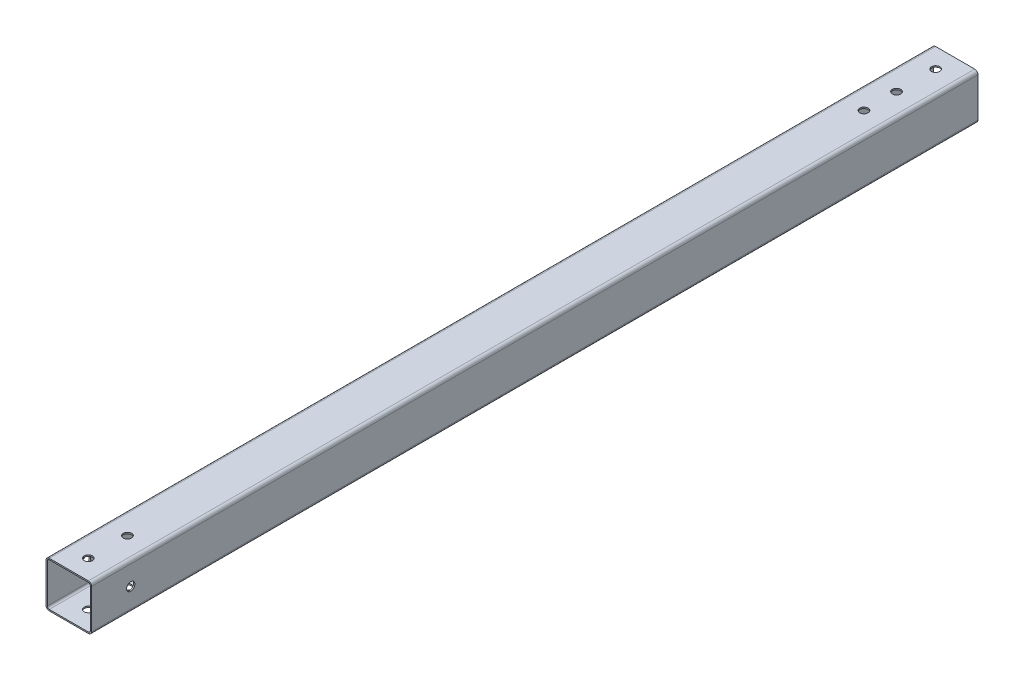
ISO-10303-21;
HEADER;
FILE_DESCRIPTION(('STEP AP214'),'2;1');
FILE_NAME('part.step','',(''),(''),'','','');
FILE_SCHEMA(('AUTOMOTIVE_DESIGN { 1 0 10303 214 1 1 1 1 }'));
ENDSEC;
DATA;
#1=APPLICATION_CONTEXT('core data for automotive mechanical design processes');
#2=APPLICATION_PROTOCOL_DEFINITION('international standard','automotive_design',2000,#1);
#3=PRODUCT_CONTEXT('',#1,'mechanical');
#4=PRODUCT('Part','Part','',(#3));
#5=PRODUCT_RELATED_PRODUCT_CATEGORY('part','',(#4));
#6=PRODUCT_DEFINITION_FORMATION('','',#4);
#7=PRODUCT_DEFINITION_CONTEXT('part definition',#1,'design');
#8=PRODUCT_DEFINITION('design','',#6,#7);
#9=PRODUCT_DEFINITION_SHAPE('','',#8);
#10=(LENGTH_UNIT() NAMED_UNIT(*) SI_UNIT(.MILLI.,.METRE.));
#11=(NAMED_UNIT(*) PLANE_ANGLE_UNIT() SI_UNIT($,.RADIAN.));
#12=(NAMED_UNIT(*) SI_UNIT($,.STERADIAN.) SOLID_ANGLE_UNIT());
#13=UNCERTAINTY_MEASURE_WITH_UNIT(LENGTH_MEASURE(1.E-05),#10,'distance_accuracy_value','');
#14=(GEOMETRIC_REPRESENTATION_CONTEXT(3) GLOBAL_UNCERTAINTY_ASSIGNED_CONTEXT((#13)) GLOBAL_UNIT_ASSIGNED_CONTEXT((#10,
#11,#12)) REPRESENTATION_CONTEXT('',''));
#15=CARTESIAN_POINT('',(0.,0.,0.));
#16=DIRECTION('',(0.,0.,1.));
#17=DIRECTION('',(1.,0.,0.));
#18=AXIS2_PLACEMENT_3D('',#15,#16,#17);
#19=CARTESIAN_POINT('',(30.,-30.0000000000002,680.));
#20=DIRECTION('',(0.,0.,-1.));
#21=DIRECTION('',(0.,1.,0.));
#22=AXIS2_PLACEMENT_3D('',#19,#20,#21);
#23=CYLINDRICAL_SURFACE('',#22,5.);
#24=CARTESIAN_POINT('',(30.,-29.9999999999998,-680.));
#25=DIRECTION('',(0.,0.,1.));
#26=DIRECTION('',(0.,-1.,0.));
#27=AXIS2_PLACEMENT_3D('',#24,#25,#26);
#28=CIRCLE('',#27,5.);
#29=CARTESIAN_POINT('',(30.,-34.9999999999998,-680.));
#30=VERTEX_POINT('',#29);
#31=CARTESIAN_POINT('',(35.,-29.9999999999998,-680.));
#32=VERTEX_POINT('',#31);
#33=EDGE_CURVE('E237',#30,#32,#28,.T.);
#34=ORIENTED_EDGE('',*,*,#33,.T.);
#35=DIRECTION('',(0.,0.,-1.));
#36=VECTOR('',#35,1.);
#37=CARTESIAN_POINT('',(35.,-30.0000000000002,680.));
#38=LINE('',#37,#36);
#39=CARTESIAN_POINT('',(35.,-30.0000000000002,680.));
#40=VERTEX_POINT('',#39);
#41=EDGE_CURVE('E12',#40,#32,#38,.T.);
#42=ORIENTED_EDGE('',*,*,#41,.F.);
#43=CARTESIAN_POINT('',(30.,-30.0000000000002,680.));
#44=DIRECTION('',(0.,0.,1.));
#45=DIRECTION('',(0.,-1.,0.));
#46=AXIS2_PLACEMENT_3D('',#43,#44,#45);
#47=CIRCLE('',#46,5.);
#48=CARTESIAN_POINT('',(30.,-35.0000000000002,680.));
#49=VERTEX_POINT('',#48);
#50=EDGE_CURVE('E316',#49,#40,#47,.T.);
#51=ORIENTED_EDGE('',*,*,#50,.F.);
#52=DIRECTION('',(0.,0.,-1.));
#53=VECTOR('',#52,1.);
#54=CARTESIAN_POINT('',(30.,-35.0000000000002,680.));
#55=LINE('',#54,#53);
#56=EDGE_CURVE('E252',#49,#30,#55,.T.);
#57=ORIENTED_EDGE('',*,*,#56,.T.);
#58=EDGE_LOOP('',(#34,#42,#51,#57));
#59=FACE_BOUND('',#58,.T.);
#60=ADVANCED_FACE('F63',(#59),#23,.T.);
#61=CARTESIAN_POINT('',(35.,-30.0000000000002,680.));
#62=DIRECTION('',(-1.,0.,0.));
#63=DIRECTION('',(0.,0.,1.));
#64=AXIS2_PLACEMENT_3D('',#61,#62,#63);
#65=PLANE('',#64);
#66=CARTESIAN_POINT('',(35.,0.,620.));
#67=DIRECTION('',(-1.,0.,0.));
#68=DIRECTION('',(0.,0.,1.));
#69=AXIS2_PLACEMENT_3D('',#66,#67,#68);
#70=CIRCLE('',#69,6.34999999999994);
#71=CARTESIAN_POINT('',(35.,0.,626.35));
#72=VERTEX_POINT('',#71);
#73=EDGE_CURVE('E397',#72,#72,#70,.T.);
#74=ORIENTED_EDGE('',*,*,#73,.T.);
#75=EDGE_LOOP('',(#74));
#76=FACE_BOUND('',#75,.T.);
#77=DIRECTION('',(0.,1.,0.));
#78=VECTOR('',#77,1.);
#79=CARTESIAN_POINT('',(35.,-29.9999999999998,-680.));
#80=LINE('',#79,#78);
#81=CARTESIAN_POINT('',(35.,30.0000000000002,-680.));
#82=VERTEX_POINT('',#81);
#83=EDGE_CURVE('E240',#32,#82,#80,.T.);
#84=ORIENTED_EDGE('',*,*,#83,.T.);
#85=DIRECTION('',(0.,0.,-1.));
#86=VECTOR('',#85,1.);
#87=CARTESIAN_POINT('',(35.,29.9999999999998,680.));
#88=LINE('',#87,#86);
#89=CARTESIAN_POINT('',(35.,29.9999999999998,680.));
#90=VERTEX_POINT('',#89);
#91=EDGE_CURVE('E73',#90,#82,#88,.T.);
#92=ORIENTED_EDGE('',*,*,#91,.F.);
#93=DIRECTION('',(0.,1.,0.));
#94=VECTOR('',#93,1.);
#95=CARTESIAN_POINT('',(35.,-30.0000000000002,680.));
#96=LINE('',#95,#94);
#97=EDGE_CURVE('E318',#40,#90,#96,.T.);
#98=ORIENTED_EDGE('',*,*,#97,.F.);
#99=ORIENTED_EDGE('',*,*,#41,.T.);
#100=EDGE_LOOP('',(#84,#92,#98,#99));
#101=FACE_BOUND('',#100,.T.);
#102=ADVANCED_FACE('F356',(#76,#101),#65,.F.);
#103=CARTESIAN_POINT('',(30.,29.9999999999998,680.));
#104=DIRECTION('',(0.,0.,-1.));
#105=DIRECTION('',(0.,1.,0.));
#106=AXIS2_PLACEMENT_3D('',#103,#104,#105);
#107=CYLINDRICAL_SURFACE('',#106,5.00000000000001);
#108=CARTESIAN_POINT('',(30.,30.0000000000002,-680.));
#109=DIRECTION('',(0.,0.,1.));
#110=DIRECTION('',(0.,-1.,0.));
#111=AXIS2_PLACEMENT_3D('',#108,#109,#110);
#112=CIRCLE('',#111,5.00000000000001);
#113=CARTESIAN_POINT('',(30.,35.0000000000003,-680.));
#114=VERTEX_POINT('',#113);
#115=EDGE_CURVE('E242',#82,#114,#112,.T.);
#116=ORIENTED_EDGE('',*,*,#115,.T.);
#117=DIRECTION('',(0.,0.,-1.));
#118=VECTOR('',#117,1.);
#119=CARTESIAN_POINT('',(30.,34.9999999999998,680.));
#120=LINE('',#119,#118);
#121=CARTESIAN_POINT('',(30.,34.9999999999998,680.));
#122=VERTEX_POINT('',#121);
#123=EDGE_CURVE('E259',#122,#114,#120,.T.);
#124=ORIENTED_EDGE('',*,*,#123,.F.);
#125=CARTESIAN_POINT('',(30.,29.9999999999998,680.));
#126=DIRECTION('',(0.,0.,1.));
#127=DIRECTION('',(0.,-1.,0.));
#128=AXIS2_PLACEMENT_3D('',#125,#126,#127);
#129=CIRCLE('',#128,5.00000000000001);
#130=EDGE_CURVE('E320',#90,#122,#129,.T.);
#131=ORIENTED_EDGE('',*,*,#130,.F.);
#132=ORIENTED_EDGE('',*,*,#91,.T.);
#133=EDGE_LOOP('',(#116,#124,#131,#132));
#134=FACE_BOUND('',#133,.T.);
#135=ADVANCED_FACE('F361',(#134),#107,.T.);
#136=CARTESIAN_POINT('',(-30.,34.9999999999998,680.));
#137=DIRECTION('',(0.,-1.,0.));
#138=DIRECTION('',(0.,0.,-1.));
#139=AXIS2_PLACEMENT_3D('',#136,#137,#138);
#140=PLANE('',#139);
#141=CARTESIAN_POINT('',(0.,35.0000000000003,-540.));
#142=DIRECTION('',(0.,-1.,0.));
#143=DIRECTION('',(0.,0.,-1.));
#144=AXIS2_PLACEMENT_3D('',#141,#142,#143);
#145=CIRCLE('',#144,6.35);
#146=CARTESIAN_POINT('',(0.,35.0000000000003,-546.35));
#147=VERTEX_POINT('',#146);
#148=EDGE_CURVE('E394',#147,#147,#145,.T.);
#149=ORIENTED_EDGE('',*,*,#148,.T.);
#150=EDGE_LOOP('',(#149));
#151=FACE_BOUND('',#150,.T.);
#152=CARTESIAN_POINT('',(0.,35.0000000000003,-650.));
#153=DIRECTION('',(0.,-1.,0.));
#154=DIRECTION('',(0.,0.,1.));
#155=AXIS2_PLACEMENT_3D('',#152,#153,#154);
#156=CIRCLE('',#155,6.35);
#157=CARTESIAN_POINT('',(0.,35.0000000000003,-643.65));
#158=VERTEX_POINT('',#157);
#159=EDGE_CURVE('E402',#158,#158,#156,.T.);
#160=ORIENTED_EDGE('',*,*,#159,.T.);
#161=EDGE_LOOP('',(#160));
#162=FACE_BOUND('',#161,.T.);
#163=CARTESIAN_POINT('',(0.,35.0000000000003,-590.));
#164=DIRECTION('',(0.,-1.,0.));
#165=DIRECTION('',(0.,0.,1.));
#166=AXIS2_PLACEMENT_3D('',#163,#164,#165);
#167=CIRCLE('',#166,6.35);
#168=CARTESIAN_POINT('',(0.,35.0000000000003,-583.65));
#169=VERTEX_POINT('',#168);
#170=EDGE_CURVE('E418',#169,#169,#167,.T.);
#171=ORIENTED_EDGE('',*,*,#170,.T.);
#172=EDGE_LOOP('',(#171));
#173=FACE_BOUND('',#172,.T.);
#174=CARTESIAN_POINT('',(0.,35.0000000000003,590.));
#175=DIRECTION('',(0.,-1.,0.));
#176=DIRECTION('',(0.,0.,-1.));
#177=AXIS2_PLACEMENT_3D('',#174,#175,#176);
#178=CIRCLE('',#177,6.35);
#179=CARTESIAN_POINT('',(0.,35.0000000000003,583.65));
#180=VERTEX_POINT('',#179);
#181=EDGE_CURVE('E411',#180,#180,#178,.T.);
#182=ORIENTED_EDGE('',*,*,#181,.T.);
#183=EDGE_LOOP('',(#182));
#184=FACE_BOUND('',#183,.T.);
#185=CARTESIAN_POINT('',(0.,35.0000000000003,650.));
#186=DIRECTION('',(0.,-1.,0.));
#187=DIRECTION('',(0.,0.,-1.));
#188=AXIS2_PLACEMENT_3D('',#185,#186,#187);
#189=CIRCLE('',#188,6.35);
#190=CARTESIAN_POINT('',(0.,35.0000000000003,643.65));
#191=VERTEX_POINT('',#190);
#192=EDGE_CURVE('E447',#191,#191,#189,.T.);
#193=ORIENTED_EDGE('',*,*,#192,.T.);
#194=EDGE_LOOP('',(#193));
#195=FACE_BOUND('',#194,.T.);
#196=DIRECTION('',(-1.,0.,0.));
#197=VECTOR('',#196,1.);
#198=CARTESIAN_POINT('',(-30.,35.0000000000003,-680.));
#199=LINE('',#198,#197);
#200=CARTESIAN_POINT('',(-30.,35.0000000000003,-680.));
#201=VERTEX_POINT('',#200);
#202=EDGE_CURVE('E244',#114,#201,#199,.T.);
#203=ORIENTED_EDGE('',*,*,#202,.T.);
#204=DIRECTION('',(0.,0.,-1.));
#205=VECTOR('',#204,1.);
#206=CARTESIAN_POINT('',(-30.,34.9999999999998,680.));
#207=LINE('',#206,#205);
#208=CARTESIAN_POINT('',(-30.,34.9999999999998,680.));
#209=VERTEX_POINT('',#208);
#210=EDGE_CURVE('E256',#209,#201,#207,.T.);
#211=ORIENTED_EDGE('',*,*,#210,.F.);
#212=DIRECTION('',(-1.,0.,0.));
#213=VECTOR('',#212,1.);
#214=CARTESIAN_POINT('',(-30.,34.9999999999998,680.));
#215=LINE('',#214,#213);
#216=EDGE_CURVE('E322',#122,#209,#215,.T.);
#217=ORIENTED_EDGE('',*,*,#216,.F.);
#218=ORIENTED_EDGE('',*,*,#123,.T.);
#219=EDGE_LOOP('',(#203,#211,#217,#218));
#220=FACE_BOUND('',#219,.T.);
#221=ADVANCED_FACE('F328',(#151,#162,#173,#184,#195,#220),#140,.F.);
#222=CARTESIAN_POINT('',(-30.,29.9999999999998,680.));
#223=DIRECTION('',(0.,0.,-1.));
#224=DIRECTION('',(0.,1.,0.));
#225=AXIS2_PLACEMENT_3D('',#222,#223,#224);
#226=CYLINDRICAL_SURFACE('',#225,5.00000000000001);
#227=CARTESIAN_POINT('',(-30.,30.0000000000002,-680.));
#228=DIRECTION('',(0.,0.,1.));
#229=DIRECTION('',(0.,-1.,0.));
#230=AXIS2_PLACEMENT_3D('',#227,#228,#229);
#231=CIRCLE('',#230,5.00000000000001);
#232=CARTESIAN_POINT('',(-35.,30.0000000000002,-680.));
#233=VERTEX_POINT('',#232);
#234=EDGE_CURVE('E246',#201,#233,#231,.T.);
#235=ORIENTED_EDGE('',*,*,#234,.T.);
#236=DIRECTION('',(0.,0.,-1.));
#237=VECTOR('',#236,1.);
#238=CARTESIAN_POINT('',(-35.,29.9999999999998,680.));
#239=LINE('',#238,#237);
#240=CARTESIAN_POINT('',(-35.,29.9999999999998,680.));
#241=VERTEX_POINT('',#240);
#242=EDGE_CURVE('E203',#241,#233,#239,.T.);
#243=ORIENTED_EDGE('',*,*,#242,.F.);
#244=CARTESIAN_POINT('',(-30.,29.9999999999998,680.));
#245=DIRECTION('',(0.,0.,1.));
#246=DIRECTION('',(0.,-1.,0.));
#247=AXIS2_PLACEMENT_3D('',#244,#245,#246);
#248=CIRCLE('',#247,5.00000000000001);
#249=EDGE_CURVE('E194',#209,#241,#248,.T.);
#250=ORIENTED_EDGE('',*,*,#249,.F.);
#251=ORIENTED_EDGE('',*,*,#210,.T.);
#252=EDGE_LOOP('',(#235,#243,#250,#251));
#253=FACE_BOUND('',#252,.T.);
#254=ADVANCED_FACE('F332',(#253),#226,.T.);
#255=CARTESIAN_POINT('',(-35.,29.9999999999998,680.));
#256=DIRECTION('',(1.,0.,0.));
#257=DIRECTION('',(0.,0.,-1.));
#258=AXIS2_PLACEMENT_3D('',#255,#256,#257);
#259=PLANE('',#258);
#260=CARTESIAN_POINT('',(-35.,0.,620.));
#261=DIRECTION('',(-1.,0.,0.));
#262=DIRECTION('',(0.,0.,1.));
#263=AXIS2_PLACEMENT_3D('',#260,#261,#262);
#264=CIRCLE('',#263,6.34999999999994);
#265=CARTESIAN_POINT('',(-35.,0.,626.35));
#266=VERTEX_POINT('',#265);
#267=EDGE_CURVE('E400',#266,#266,#264,.T.);
#268=ORIENTED_EDGE('',*,*,#267,.F.);
#269=EDGE_LOOP('',(#268));
#270=FACE_BOUND('',#269,.T.);
#271=DIRECTION('',(0.,-1.,0.));
#272=VECTOR('',#271,1.);
#273=CARTESIAN_POINT('',(-35.,30.0000000000002,-680.));
#274=LINE('',#273,#272);
#275=CARTESIAN_POINT('',(-35.,-29.9999999999998,-680.));
#276=VERTEX_POINT('',#275);
#277=EDGE_CURVE('E202',#233,#276,#274,.T.);
#278=ORIENTED_EDGE('',*,*,#277,.T.);
#279=DIRECTION('',(0.,0.,-1.));
#280=VECTOR('',#279,1.);
#281=CARTESIAN_POINT('',(-35.,-30.0000000000002,680.));
#282=LINE('',#281,#280);
#283=CARTESIAN_POINT('',(-35.,-30.0000000000002,680.));
#284=VERTEX_POINT('',#283);
#285=EDGE_CURVE('E199',#284,#276,#282,.T.);
#286=ORIENTED_EDGE('',*,*,#285,.F.);
#287=DIRECTION('',(0.,-1.,0.));
#288=VECTOR('',#287,1.);
#289=CARTESIAN_POINT('',(-35.,29.9999999999998,680.));
#290=LINE('',#289,#288);
#291=EDGE_CURVE('E188',#241,#284,#290,.T.);
#292=ORIENTED_EDGE('',*,*,#291,.F.);
#293=ORIENTED_EDGE('',*,*,#242,.T.);
#294=EDGE_LOOP('',(#278,#286,#292,#293));
#295=FACE_BOUND('',#294,.T.);
#296=ADVANCED_FACE('F200',(#270,#295),#259,.F.);
#297=CARTESIAN_POINT('',(-30.,-30.0000000000002,680.));
#298=DIRECTION('',(0.,0.,-1.));
#299=DIRECTION('',(0.,1.,0.));
#300=AXIS2_PLACEMENT_3D('',#297,#298,#299);
#301=CYLINDRICAL_SURFACE('',#300,5.);
#302=CARTESIAN_POINT('',(-30.,-29.9999999999998,-680.));
#303=DIRECTION('',(0.,0.,1.));
#304=DIRECTION('',(0.,-1.,0.));
#305=AXIS2_PLACEMENT_3D('',#302,#303,#304);
#306=CIRCLE('',#305,5.);
#307=CARTESIAN_POINT('',(-30.,-34.9999999999998,-680.));
#308=VERTEX_POINT('',#307);
#309=EDGE_CURVE('E135',#276,#308,#306,.T.);
#310=ORIENTED_EDGE('',*,*,#309,.T.);
#311=DIRECTION('',(0.,0.,-1.));
#312=VECTOR('',#311,1.);
#313=CARTESIAN_POINT('',(-30.,-35.0000000000002,680.));
#314=LINE('',#313,#312);
#315=CARTESIAN_POINT('',(-30.,-35.0000000000002,680.));
#316=VERTEX_POINT('',#315);
#317=EDGE_CURVE('E204',#316,#308,#314,.T.);
#318=ORIENTED_EDGE('',*,*,#317,.F.);
#319=CARTESIAN_POINT('',(-30.,-30.0000000000002,680.));
#320=DIRECTION('',(0.,0.,1.));
#321=DIRECTION('',(0.,-1.,0.));
#322=AXIS2_PLACEMENT_3D('',#319,#320,#321);
#323=CIRCLE('',#322,5.);
#324=EDGE_CURVE('E192',#284,#316,#323,.T.);
#325=ORIENTED_EDGE('',*,*,#324,.F.);
#326=ORIENTED_EDGE('',*,*,#285,.T.);
#327=EDGE_LOOP('',(#310,#318,#325,#326));
#328=FACE_BOUND('',#327,.T.);
#329=ADVANCED_FACE('F206',(#328),#301,.T.);
#330=CARTESIAN_POINT('',(30.,29.9999999999998,680.));
#331=DIRECTION('',(0.,0.,-1.));
#332=DIRECTION('',(0.,1.,0.));
#333=AXIS2_PLACEMENT_3D('',#330,#331,#332);
#334=CYLINDRICAL_SURFACE('',#333,3.);
#335=CARTESIAN_POINT('',(30.,30.0000000000002,-680.));
#336=DIRECTION('',(0.,0.,1.));
#337=DIRECTION('',(0.,-1.,0.));
#338=AXIS2_PLACEMENT_3D('',#335,#336,#337);
#339=CIRCLE('',#338,3.);
#340=CARTESIAN_POINT('',(33.,30.0000000000002,-680.));
#341=VERTEX_POINT('',#340);
#342=CARTESIAN_POINT('',(30.,33.0000000000002,-680.));
#343=VERTEX_POINT('',#342);
#344=EDGE_CURVE('E212',#341,#343,#339,.T.);
#345=ORIENTED_EDGE('',*,*,#344,.F.);
#346=DIRECTION('',(0.,0.,-1.));
#347=VECTOR('',#346,1.);
#348=CARTESIAN_POINT('',(33.,29.9999999999998,680.));
#349=LINE('',#348,#347);
#350=CARTESIAN_POINT('',(33.,29.9999999999998,680.));
#351=VERTEX_POINT('',#350);
#352=EDGE_CURVE('E149',#351,#341,#349,.T.);
#353=ORIENTED_EDGE('',*,*,#352,.F.);
#354=CARTESIAN_POINT('',(30.,29.9999999999998,680.));
#355=DIRECTION('',(0.,0.,1.));
#356=DIRECTION('',(0.,-1.,0.));
#357=AXIS2_PLACEMENT_3D('',#354,#355,#356);
#358=CIRCLE('',#357,3.);
#359=CARTESIAN_POINT('',(30.,32.9999999999998,680.));
#360=VERTEX_POINT('',#359);
#361=EDGE_CURVE('E251',#351,#360,#358,.T.);
#362=ORIENTED_EDGE('',*,*,#361,.T.);
#363=DIRECTION('',(0.,0.,-1.));
#364=VECTOR('',#363,1.);
#365=CARTESIAN_POINT('',(30.,32.9999999999998,680.));
#366=LINE('',#365,#364);
#367=EDGE_CURVE('E208',#360,#343,#366,.T.);
#368=ORIENTED_EDGE('',*,*,#367,.T.);
#369=EDGE_LOOP('',(#345,#353,#362,#368));
#370=FACE_BOUND('',#369,.T.);
#371=ADVANCED_FACE('F65',(#370),#334,.F.);
#372=CARTESIAN_POINT('',(33.,-30.0000000000002,680.));
#373=DIRECTION('',(-1.,0.,0.));
#374=DIRECTION('',(0.,0.,1.));
#375=AXIS2_PLACEMENT_3D('',#372,#373,#374);
#376=PLANE('',#375);
#377=CARTESIAN_POINT('',(33.,0.,620.));
#378=DIRECTION('',(-1.,0.,0.));
#379=DIRECTION('',(0.,0.,1.));
#380=AXIS2_PLACEMENT_3D('',#377,#378,#379);
#381=CIRCLE('',#380,6.34999999999994);
#382=CARTESIAN_POINT('',(33.,0.,626.35));
#383=VERTEX_POINT('',#382);
#384=EDGE_CURVE('E389',#383,#383,#381,.T.);
#385=ORIENTED_EDGE('',*,*,#384,.F.);
#386=EDGE_LOOP('',(#385));
#387=FACE_BOUND('',#386,.T.);
#388=DIRECTION('',(0.,1.,0.));
#389=VECTOR('',#388,1.);
#390=CARTESIAN_POINT('',(33.,-29.9999999999998,-680.));
#391=LINE('',#390,#389);
#392=CARTESIAN_POINT('',(33.,-29.9999999999998,-680.));
#393=VERTEX_POINT('',#392);
#394=EDGE_CURVE('E215',#393,#341,#391,.T.);
#395=ORIENTED_EDGE('',*,*,#394,.F.);
#396=DIRECTION('',(0.,0.,-1.));
#397=VECTOR('',#396,1.);
#398=CARTESIAN_POINT('',(33.,-30.0000000000002,680.));
#399=LINE('',#398,#397);
#400=CARTESIAN_POINT('',(33.,-30.0000000000002,680.));
#401=VERTEX_POINT('',#400);
#402=EDGE_CURVE('E275',#401,#393,#399,.T.);
#403=ORIENTED_EDGE('',*,*,#402,.F.);
#404=DIRECTION('',(0.,1.,0.));
#405=VECTOR('',#404,1.);
#406=CARTESIAN_POINT('',(33.,-30.0000000000002,680.));
#407=LINE('',#406,#405);
#408=EDGE_CURVE('E281',#401,#351,#407,.T.);
#409=ORIENTED_EDGE('',*,*,#408,.T.);
#410=ORIENTED_EDGE('',*,*,#352,.T.);
#411=EDGE_LOOP('',(#395,#403,#409,#410));
#412=FACE_BOUND('',#411,.T.);
#413=ADVANCED_FACE('F279',(#387,#412),#376,.T.);
#414=CARTESIAN_POINT('',(30.,-30.0000000000002,680.));
#415=DIRECTION('',(0.,0.,-1.));
#416=DIRECTION('',(0.,1.,0.));
#417=AXIS2_PLACEMENT_3D('',#414,#415,#416);
#418=CYLINDRICAL_SURFACE('',#417,2.99999999999999);
#419=CARTESIAN_POINT('',(30.,-29.9999999999998,-680.));
#420=DIRECTION('',(0.,0.,1.));
#421=DIRECTION('',(0.,-1.,0.));
#422=AXIS2_PLACEMENT_3D('',#419,#420,#421);
#423=CIRCLE('',#422,2.99999999999999);
#424=CARTESIAN_POINT('',(30.,-32.9999999999998,-680.));
#425=VERTEX_POINT('',#424);
#426=EDGE_CURVE('E219',#425,#393,#423,.T.);
#427=ORIENTED_EDGE('',*,*,#426,.F.);
#428=DIRECTION('',(0.,0.,-1.));
#429=VECTOR('',#428,1.);
#430=CARTESIAN_POINT('',(30.,-33.0000000000002,680.));
#431=LINE('',#430,#429);
#432=CARTESIAN_POINT('',(30.,-33.0000000000002,680.));
#433=VERTEX_POINT('',#432);
#434=EDGE_CURVE('E273',#433,#425,#431,.T.);
#435=ORIENTED_EDGE('',*,*,#434,.F.);
#436=CARTESIAN_POINT('',(30.,-30.0000000000002,680.));
#437=DIRECTION('',(0.,0.,1.));
#438=DIRECTION('',(0.,-1.,0.));
#439=AXIS2_PLACEMENT_3D('',#436,#437,#438);
#440=CIRCLE('',#439,2.99999999999999);
#441=EDGE_CURVE('E292',#433,#401,#440,.T.);
#442=ORIENTED_EDGE('',*,*,#441,.T.);
#443=ORIENTED_EDGE('',*,*,#402,.T.);
#444=EDGE_LOOP('',(#427,#435,#442,#443));
#445=FACE_BOUND('',#444,.T.);
#446=ADVANCED_FACE('F289',(#445),#418,.F.);
#447=CARTESIAN_POINT('',(30.,-33.0000000000002,680.));
#448=DIRECTION('',(0.,1.,0.));
#449=DIRECTION('',(0.,0.,1.));
#450=AXIS2_PLACEMENT_3D('',#447,#448,#449);
#451=PLANE('',#450);
#452=CARTESIAN_POINT('',(0.,-32.9999999999998,-540.));
#453=DIRECTION('',(0.,1.,0.));
#454=DIRECTION('',(0.,0.,1.));
#455=AXIS2_PLACEMENT_3D('',#452,#453,#454);
#456=CIRCLE('',#455,6.35);
#457=CARTESIAN_POINT('',(0.,-32.9999999999998,-533.65));
#458=VERTEX_POINT('',#457);
#459=EDGE_CURVE('E443',#458,#458,#456,.T.);
#460=ORIENTED_EDGE('',*,*,#459,.F.);
#461=EDGE_LOOP('',(#460));
#462=FACE_BOUND('',#461,.T.);
#463=CARTESIAN_POINT('',(0.,-32.9999999999998,-650.));
#464=DIRECTION('',(0.,1.,0.));
#465=DIRECTION('',(0.,0.,1.));
#466=AXIS2_PLACEMENT_3D('',#463,#464,#465);
#467=CIRCLE('',#466,6.35);
#468=CARTESIAN_POINT('',(0.,-32.9999999999998,-643.65));
#469=VERTEX_POINT('',#468);
#470=EDGE_CURVE('E437',#469,#469,#467,.T.);
#471=ORIENTED_EDGE('',*,*,#470,.F.);
#472=EDGE_LOOP('',(#471));
#473=FACE_BOUND('',#472,.T.);
#474=CARTESIAN_POINT('',(0.,-32.9999999999998,-590.));
#475=DIRECTION('',(0.,1.,0.));
#476=DIRECTION('',(0.,0.,1.));
#477=AXIS2_PLACEMENT_3D('',#474,#475,#476);
#478=CIRCLE('',#477,6.35);
#479=CARTESIAN_POINT('',(0.,-32.9999999999998,-583.65));
#480=VERTEX_POINT('',#479);
#481=EDGE_CURVE('E431',#480,#480,#478,.T.);
#482=ORIENTED_EDGE('',*,*,#481,.F.);
#483=EDGE_LOOP('',(#482));
#484=FACE_BOUND('',#483,.T.);
#485=CARTESIAN_POINT('',(0.,-33.0000000000001,590.));
#486=DIRECTION('',(0.,1.,0.));
#487=DIRECTION('',(0.,0.,1.));
#488=AXIS2_PLACEMENT_3D('',#485,#486,#487);
#489=CIRCLE('',#488,6.35);
#490=CARTESIAN_POINT('',(0.,-33.0000000000001,596.35));
#491=VERTEX_POINT('',#490);
#492=EDGE_CURVE('E425',#491,#491,#489,.T.);
#493=ORIENTED_EDGE('',*,*,#492,.F.);
#494=EDGE_LOOP('',(#493));
#495=FACE_BOUND('',#494,.T.);
#496=CARTESIAN_POINT('',(0.,-33.0000000000002,650.));
#497=DIRECTION('',(0.,1.,0.));
#498=DIRECTION('',(0.,0.,1.));
#499=AXIS2_PLACEMENT_3D('',#496,#497,#498);
#500=CIRCLE('',#499,6.35);
#501=CARTESIAN_POINT('',(0.,-33.0000000000002,656.35));
#502=VERTEX_POINT('',#501);
#503=EDGE_CURVE('E216',#502,#502,#500,.T.);
#504=ORIENTED_EDGE('',*,*,#503,.F.);
#505=EDGE_LOOP('',(#504));
#506=FACE_BOUND('',#505,.T.);
#507=DIRECTION('',(1.,0.,0.));
#508=VECTOR('',#507,1.);
#509=CARTESIAN_POINT('',(30.,-32.9999999999998,-680.));
#510=LINE('',#509,#508);
#511=CARTESIAN_POINT('',(-30.,-32.9999999999998,-680.));
#512=VERTEX_POINT('',#511);
#513=EDGE_CURVE('E222',#512,#425,#510,.T.);
#514=ORIENTED_EDGE('',*,*,#513,.F.);
#515=DIRECTION('',(0.,0.,-1.));
#516=VECTOR('',#515,1.);
#517=CARTESIAN_POINT('',(-30.,-33.0000000000002,680.));
#518=LINE('',#517,#516);
#519=CARTESIAN_POINT('',(-30.,-33.0000000000002,680.));
#520=VERTEX_POINT('',#519);
#521=EDGE_CURVE('E271',#520,#512,#518,.T.);
#522=ORIENTED_EDGE('',*,*,#521,.F.);
#523=DIRECTION('',(1.,0.,0.));
#524=VECTOR('',#523,1.);
#525=CARTESIAN_POINT('',(30.,-33.0000000000002,680.));
#526=LINE('',#525,#524);
#527=EDGE_CURVE('E298',#520,#433,#526,.T.);
#528=ORIENTED_EDGE('',*,*,#527,.T.);
#529=ORIENTED_EDGE('',*,*,#434,.T.);
#530=EDGE_LOOP('',(#514,#522,#528,#529));
#531=FACE_BOUND('',#530,.T.);
#532=ADVANCED_FACE('F376',(#462,#473,#484,#495,#506,#531),#451,.T.);
#533=CARTESIAN_POINT('',(-30.,-30.0000000000002,680.));
#534=DIRECTION('',(0.,0.,-1.));
#535=DIRECTION('',(0.,1.,0.));
#536=AXIS2_PLACEMENT_3D('',#533,#534,#535);
#537=CYLINDRICAL_SURFACE('',#536,2.99999999999999);
#538=CARTESIAN_POINT('',(-30.,-29.9999999999998,-680.));
#539=DIRECTION('',(0.,0.,1.));
#540=DIRECTION('',(0.,-1.,0.));
#541=AXIS2_PLACEMENT_3D('',#538,#539,#540);
#542=CIRCLE('',#541,2.99999999999999);
#543=CARTESIAN_POINT('',(-33.,-29.9999999999998,-680.));
#544=VERTEX_POINT('',#543);
#545=EDGE_CURVE('E225',#544,#512,#542,.T.);
#546=ORIENTED_EDGE('',*,*,#545,.F.);
#547=DIRECTION('',(0.,0.,-1.));
#548=VECTOR('',#547,1.);
#549=CARTESIAN_POINT('',(-33.,-30.0000000000002,680.));
#550=LINE('',#549,#548);
#551=CARTESIAN_POINT('',(-33.,-30.0000000000002,680.));
#552=VERTEX_POINT('',#551);
#553=EDGE_CURVE('E269',#552,#544,#550,.T.);
#554=ORIENTED_EDGE('',*,*,#553,.F.);
#555=CARTESIAN_POINT('',(-30.,-30.0000000000002,680.));
#556=DIRECTION('',(0.,0.,1.));
#557=DIRECTION('',(0.,-1.,0.));
#558=AXIS2_PLACEMENT_3D('',#555,#556,#557);
#559=CIRCLE('',#558,2.99999999999999);
#560=EDGE_CURVE('E304',#552,#520,#559,.T.);
#561=ORIENTED_EDGE('',*,*,#560,.T.);
#562=ORIENTED_EDGE('',*,*,#521,.T.);
#563=EDGE_LOOP('',(#546,#554,#561,#562));
#564=FACE_BOUND('',#563,.T.);
#565=ADVANCED_FACE('F372',(#564),#537,.F.);
#566=CARTESIAN_POINT('',(-33.,29.9999999999998,680.));
#567=DIRECTION('',(1.,0.,0.));
#568=DIRECTION('',(0.,0.,-1.));
#569=AXIS2_PLACEMENT_3D('',#566,#567,#568);
#570=PLANE('',#569);
#571=CARTESIAN_POINT('',(-33.,0.,620.));
#572=DIRECTION('',(1.,0.,0.));
#573=DIRECTION('',(0.,0.,-1.));
#574=AXIS2_PLACEMENT_3D('',#571,#572,#573);
#575=CIRCLE('',#574,6.34999999999994);
#576=CARTESIAN_POINT('',(-33.,0.,613.65));
#577=VERTEX_POINT('',#576);
#578=EDGE_CURVE('E67',#577,#577,#575,.T.);
#579=ORIENTED_EDGE('',*,*,#578,.F.);
#580=EDGE_LOOP('',(#579));
#581=FACE_BOUND('',#580,.T.);
#582=DIRECTION('',(0.,-1.,0.));
#583=VECTOR('',#582,1.);
#584=CARTESIAN_POINT('',(-33.,30.0000000000002,-680.));
#585=LINE('',#584,#583);
#586=CARTESIAN_POINT('',(-33.,30.0000000000002,-680.));
#587=VERTEX_POINT('',#586);
#588=EDGE_CURVE('E228',#587,#544,#585,.T.);
#589=ORIENTED_EDGE('',*,*,#588,.F.);
#590=DIRECTION('',(0.,0.,-1.));
#591=VECTOR('',#590,1.);
#592=CARTESIAN_POINT('',(-33.,29.9999999999998,680.));
#593=LINE('',#592,#591);
#594=CARTESIAN_POINT('',(-33.,29.9999999999998,680.));
#595=VERTEX_POINT('',#594);
#596=EDGE_CURVE('E267',#595,#587,#593,.T.);
#597=ORIENTED_EDGE('',*,*,#596,.F.);
#598=DIRECTION('',(0.,-1.,0.));
#599=VECTOR('',#598,1.);
#600=CARTESIAN_POINT('',(-33.,29.9999999999998,680.));
#601=LINE('',#600,#599);
#602=EDGE_CURVE('E307',#595,#552,#601,.T.);
#603=ORIENTED_EDGE('',*,*,#602,.T.);
#604=ORIENTED_EDGE('',*,*,#553,.T.);
#605=EDGE_LOOP('',(#589,#597,#603,#604));
#606=FACE_BOUND('',#605,.T.);
#607=ADVANCED_FACE('F368',(#581,#606),#570,.T.);
#608=CARTESIAN_POINT('',(-30.,29.9999999999998,680.));
#609=DIRECTION('',(0.,0.,-1.));
#610=DIRECTION('',(0.,1.,0.));
#611=AXIS2_PLACEMENT_3D('',#608,#609,#610);
#612=CYLINDRICAL_SURFACE('',#611,3.);
#613=CARTESIAN_POINT('',(-30.,30.0000000000002,-680.));
#614=DIRECTION('',(0.,0.,1.));
#615=DIRECTION('',(0.,-1.,0.));
#616=AXIS2_PLACEMENT_3D('',#613,#614,#615);
#617=CIRCLE('',#616,3.);
#618=CARTESIAN_POINT('',(-30.,33.0000000000002,-680.));
#619=VERTEX_POINT('',#618);
#620=EDGE_CURVE('E231',#619,#587,#617,.T.);
#621=ORIENTED_EDGE('',*,*,#620,.F.);
#622=DIRECTION('',(0.,0.,-1.));
#623=VECTOR('',#622,1.);
#624=CARTESIAN_POINT('',(-30.,32.9999999999998,680.));
#625=LINE('',#624,#623);
#626=CARTESIAN_POINT('',(-30.,32.9999999999998,680.));
#627=VERTEX_POINT('',#626);
#628=EDGE_CURVE('E265',#627,#619,#625,.T.);
#629=ORIENTED_EDGE('',*,*,#628,.F.);
#630=CARTESIAN_POINT('',(-30.,29.9999999999998,680.));
#631=DIRECTION('',(0.,0.,1.));
#632=DIRECTION('',(0.,-1.,0.));
#633=AXIS2_PLACEMENT_3D('',#630,#631,#632);
#634=CIRCLE('',#633,3.);
#635=EDGE_CURVE('E310',#627,#595,#634,.T.);
#636=ORIENTED_EDGE('',*,*,#635,.T.);
#637=ORIENTED_EDGE('',*,*,#596,.T.);
#638=EDGE_LOOP('',(#621,#629,#636,#637));
#639=FACE_BOUND('',#638,.T.);
#640=ADVANCED_FACE('F348',(#639),#612,.F.);
#641=CARTESIAN_POINT('',(-30.,32.9999999999998,680.));
#642=DIRECTION('',(0.,-1.,0.));
#643=DIRECTION('',(0.,0.,-1.));
#644=AXIS2_PLACEMENT_3D('',#641,#642,#643);
#645=PLANE('',#644);
#646=CARTESIAN_POINT('',(0.,33.0000000000002,-540.));
#647=DIRECTION('',(0.,-1.,0.));
#648=DIRECTION('',(0.,0.,-1.));
#649=AXIS2_PLACEMENT_3D('',#646,#647,#648);
#650=CIRCLE('',#649,6.35);
#651=CARTESIAN_POINT('',(0.,33.0000000000002,-546.35));
#652=VERTEX_POINT('',#651);
#653=EDGE_CURVE('E440',#652,#652,#650,.T.);
#654=ORIENTED_EDGE('',*,*,#653,.F.);
#655=EDGE_LOOP('',(#654));
#656=FACE_BOUND('',#655,.T.);
#657=CARTESIAN_POINT('',(0.,33.0000000000002,-650.));
#658=DIRECTION('',(0.,-1.,0.));
#659=DIRECTION('',(0.,0.,-1.));
#660=AXIS2_PLACEMENT_3D('',#657,#658,#659);
#661=CIRCLE('',#660,6.35);
#662=CARTESIAN_POINT('',(0.,33.0000000000002,-656.35));
#663=VERTEX_POINT('',#662);
#664=EDGE_CURVE('E434',#663,#663,#661,.T.);
#665=ORIENTED_EDGE('',*,*,#664,.F.);
#666=EDGE_LOOP('',(#665));
#667=FACE_BOUND('',#666,.T.);
#668=CARTESIAN_POINT('',(0.,33.0000000000002,-590.));
#669=DIRECTION('',(0.,-1.,0.));
#670=DIRECTION('',(0.,0.,-1.));
#671=AXIS2_PLACEMENT_3D('',#668,#669,#670);
#672=CIRCLE('',#671,6.35);
#673=CARTESIAN_POINT('',(0.,33.0000000000002,-596.35));
#674=VERTEX_POINT('',#673);
#675=EDGE_CURVE('E428',#674,#674,#672,.T.);
#676=ORIENTED_EDGE('',*,*,#675,.F.);
#677=EDGE_LOOP('',(#676));
#678=FACE_BOUND('',#677,.T.);
#679=CARTESIAN_POINT('',(0.,32.9999999999999,590.));
#680=DIRECTION('',(0.,-1.,0.));
#681=DIRECTION('',(0.,0.,-1.));
#682=AXIS2_PLACEMENT_3D('',#679,#680,#681);
#683=CIRCLE('',#682,6.35);
#684=CARTESIAN_POINT('',(0.,32.9999999999999,583.65));
#685=VERTEX_POINT('',#684);
#686=EDGE_CURVE('E414',#685,#685,#683,.T.);
#687=ORIENTED_EDGE('',*,*,#686,.F.);
#688=EDGE_LOOP('',(#687));
#689=FACE_BOUND('',#688,.T.);
#690=CARTESIAN_POINT('',(0.,32.9999999999998,650.));
#691=DIRECTION('',(0.,-1.,0.));
#692=DIRECTION('',(0.,0.,-1.));
#693=AXIS2_PLACEMENT_3D('',#690,#691,#692);
#694=CIRCLE('',#693,6.35);
#695=CARTESIAN_POINT('',(0.,32.9999999999998,643.65));
#696=VERTEX_POINT('',#695);
#697=EDGE_CURVE('E450',#696,#696,#694,.T.);
#698=ORIENTED_EDGE('',*,*,#697,.F.);
#699=EDGE_LOOP('',(#698));
#700=FACE_BOUND('',#699,.T.);
#701=DIRECTION('',(-1.,0.,0.));
#702=VECTOR('',#701,1.);
#703=CARTESIAN_POINT('',(-30.,33.0000000000002,-680.));
#704=LINE('',#703,#702);
#705=EDGE_CURVE('E234',#343,#619,#704,.T.);
#706=ORIENTED_EDGE('',*,*,#705,.F.);
#707=ORIENTED_EDGE('',*,*,#367,.F.);
#708=DIRECTION('',(-1.,0.,0.));
#709=VECTOR('',#708,1.);
#710=CARTESIAN_POINT('',(-30.,32.9999999999998,680.));
#711=LINE('',#710,#709);
#712=EDGE_CURVE('E313',#360,#627,#711,.T.);
#713=ORIENTED_EDGE('',*,*,#712,.T.);
#714=ORIENTED_EDGE('',*,*,#628,.T.);
#715=EDGE_LOOP('',(#706,#707,#713,#714));
#716=FACE_BOUND('',#715,.T.);
#717=ADVANCED_FACE('F340',(#656,#667,#678,#689,#700,#716),#645,.T.);
#718=CARTESIAN_POINT('',(30.,-35.0000000000002,680.));
#719=DIRECTION('',(0.,1.,0.));
#720=DIRECTION('',(0.,0.,1.));
#721=AXIS2_PLACEMENT_3D('',#718,#719,#720);
#722=PLANE('',#721);
#723=CARTESIAN_POINT('',(0.,-35.,-540.));
#724=DIRECTION('',(0.,-1.,0.));
#725=DIRECTION('',(0.,0.,-1.));
#726=AXIS2_PLACEMENT_3D('',#723,#724,#725);
#727=CIRCLE('',#726,6.35);
#728=CARTESIAN_POINT('',(0.,-35.,-546.35));
#729=VERTEX_POINT('',#728);
#730=EDGE_CURVE('E391',#729,#729,#727,.T.);
#731=ORIENTED_EDGE('',*,*,#730,.F.);
#732=EDGE_LOOP('',(#731));
#733=FACE_BOUND('',#732,.T.);
#734=CARTESIAN_POINT('',(0.,-35.,-650.));
#735=DIRECTION('',(0.,-1.,0.));
#736=DIRECTION('',(0.,0.,1.));
#737=AXIS2_PLACEMENT_3D('',#734,#735,#736);
#738=CIRCLE('',#737,6.35);
#739=CARTESIAN_POINT('',(0.,-35.,-643.65));
#740=VERTEX_POINT('',#739);
#741=EDGE_CURVE('E406',#740,#740,#738,.T.);
#742=ORIENTED_EDGE('',*,*,#741,.F.);
#743=EDGE_LOOP('',(#742));
#744=FACE_BOUND('',#743,.T.);
#745=CARTESIAN_POINT('',(0.,-35.,-590.));
#746=DIRECTION('',(0.,-1.,0.));
#747=DIRECTION('',(0.,0.,1.));
#748=AXIS2_PLACEMENT_3D('',#745,#746,#747);
#749=CIRCLE('',#748,6.35);
#750=CARTESIAN_POINT('',(0.,-35.,-583.65));
#751=VERTEX_POINT('',#750);
#752=EDGE_CURVE('E405',#751,#751,#749,.T.);
#753=ORIENTED_EDGE('',*,*,#752,.F.);
#754=EDGE_LOOP('',(#753));
#755=FACE_BOUND('',#754,.T.);
#756=CARTESIAN_POINT('',(0.,-35.,590.));
#757=DIRECTION('',(0.,-1.,0.));
#758=DIRECTION('',(0.,0.,-1.));
#759=AXIS2_PLACEMENT_3D('',#756,#757,#758);
#760=CIRCLE('',#759,6.35);
#761=CARTESIAN_POINT('',(0.,-35.,583.65));
#762=VERTEX_POINT('',#761);
#763=EDGE_CURVE('E415',#762,#762,#760,.T.);
#764=ORIENTED_EDGE('',*,*,#763,.F.);
#765=EDGE_LOOP('',(#764));
#766=FACE_BOUND('',#765,.T.);
#767=CARTESIAN_POINT('',(0.,-35.,650.));
#768=DIRECTION('',(0.,-1.,0.));
#769=DIRECTION('',(0.,0.,-1.));
#770=AXIS2_PLACEMENT_3D('',#767,#768,#769);
#771=CIRCLE('',#770,6.35);
#772=CARTESIAN_POINT('',(0.,-35.,643.65));
#773=VERTEX_POINT('',#772);
#774=EDGE_CURVE('E446',#773,#773,#771,.T.);
#775=ORIENTED_EDGE('',*,*,#774,.F.);
#776=EDGE_LOOP('',(#775));
#777=FACE_BOUND('',#776,.T.);
#778=DIRECTION('',(1.,0.,0.));
#779=VECTOR('',#778,1.);
#780=CARTESIAN_POINT('',(30.,-34.9999999999998,-680.));
#781=LINE('',#780,#779);
#782=EDGE_CURVE('E141',#308,#30,#781,.T.);
#783=ORIENTED_EDGE('',*,*,#782,.T.);
#784=ORIENTED_EDGE('',*,*,#56,.F.);
#785=DIRECTION('',(1.,0.,0.));
#786=VECTOR('',#785,1.);
#787=CARTESIAN_POINT('',(30.,-35.0000000000002,680.));
#788=LINE('',#787,#786);
#789=EDGE_CURVE('E82',#316,#49,#788,.T.);
#790=ORIENTED_EDGE('',*,*,#789,.F.);
#791=ORIENTED_EDGE('',*,*,#317,.T.);
#792=EDGE_LOOP('',(#783,#784,#790,#791));
#793=FACE_BOUND('',#792,.T.);
#794=ADVANCED_FACE('F338',(#733,#744,#755,#766,#777,#793),#722,.F.);
#795=CARTESIAN_POINT('',(30.,-30.0000000000002,680.));
#796=DIRECTION('',(0.,0.,1.));
#797=DIRECTION('',(0.,-1.,0.));
#798=AXIS2_PLACEMENT_3D('',#795,#796,#797);
#799=PLANE('',#798);
#800=ORIENTED_EDGE('',*,*,#361,.F.);
#801=ORIENTED_EDGE('',*,*,#408,.F.);
#802=ORIENTED_EDGE('',*,*,#441,.F.);
#803=ORIENTED_EDGE('',*,*,#527,.F.);
#804=ORIENTED_EDGE('',*,*,#560,.F.);
#805=ORIENTED_EDGE('',*,*,#602,.F.);
#806=ORIENTED_EDGE('',*,*,#635,.F.);
#807=ORIENTED_EDGE('',*,*,#712,.F.);
#808=EDGE_LOOP('',(#800,#801,#802,#803,#804,#805,#806,#807));
#809=FACE_BOUND('',#808,.T.);
#810=ORIENTED_EDGE('',*,*,#50,.T.);
#811=ORIENTED_EDGE('',*,*,#97,.T.);
#812=ORIENTED_EDGE('',*,*,#130,.T.);
#813=ORIENTED_EDGE('',*,*,#216,.T.);
#814=ORIENTED_EDGE('',*,*,#249,.T.);
#815=ORIENTED_EDGE('',*,*,#291,.T.);
#816=ORIENTED_EDGE('',*,*,#324,.T.);
#817=ORIENTED_EDGE('',*,*,#789,.T.);
#818=EDGE_LOOP('',(#810,#811,#812,#813,#814,#815,#816,#817));
#819=FACE_BOUND('',#818,.T.);
#820=ADVANCED_FACE('F190',(#809,#819),#799,.T.);
#821=CARTESIAN_POINT('',(30.,-29.9999999999998,-680.));
#822=DIRECTION('',(0.,0.,1.));
#823=DIRECTION('',(0.,-1.,0.));
#824=AXIS2_PLACEMENT_3D('',#821,#822,#823);
#825=PLANE('',#824);
#826=ORIENTED_EDGE('',*,*,#344,.T.);
#827=ORIENTED_EDGE('',*,*,#705,.T.);
#828=ORIENTED_EDGE('',*,*,#620,.T.);
#829=ORIENTED_EDGE('',*,*,#588,.T.);
#830=ORIENTED_EDGE('',*,*,#545,.T.);
#831=ORIENTED_EDGE('',*,*,#513,.T.);
#832=ORIENTED_EDGE('',*,*,#426,.T.);
#833=ORIENTED_EDGE('',*,*,#394,.T.);
#834=EDGE_LOOP('',(#826,#827,#828,#829,#830,#831,#832,#833));
#835=FACE_BOUND('',#834,.T.);
#836=ORIENTED_EDGE('',*,*,#33,.F.);
#837=ORIENTED_EDGE('',*,*,#782,.F.);
#838=ORIENTED_EDGE('',*,*,#309,.F.);
#839=ORIENTED_EDGE('',*,*,#277,.F.);
#840=ORIENTED_EDGE('',*,*,#234,.F.);
#841=ORIENTED_EDGE('',*,*,#202,.F.);
#842=ORIENTED_EDGE('',*,*,#115,.F.);
#843=ORIENTED_EDGE('',*,*,#83,.F.);
#844=EDGE_LOOP('',(#836,#837,#838,#839,#840,#841,#842,#843));
#845=FACE_BOUND('',#844,.T.);
#846=ADVANCED_FACE('F284',(#835,#845),#825,.F.);
#847=CARTESIAN_POINT('',(0.,35.0000000000003,650.));
#848=DIRECTION('',(0.,-1.,0.));
#849=DIRECTION('',(0.,0.,-1.));
#850=AXIS2_PLACEMENT_3D('',#847,#848,#849);
#851=CYLINDRICAL_SURFACE('',#850,6.35);
#852=ORIENTED_EDGE('',*,*,#503,.T.);
#853=EDGE_LOOP('',(#852));
#854=FACE_BOUND('',#853,.T.);
#855=ORIENTED_EDGE('',*,*,#774,.T.);
#856=EDGE_LOOP('',(#855));
#857=FACE_BOUND('',#856,.T.);
#858=ADVANCED_FACE('F457',(#854,#857),#851,.F.);
#859=ORIENTED_EDGE('',*,*,#697,.T.);
#860=EDGE_LOOP('',(#859));
#861=FACE_BOUND('',#860,.T.);
#862=ORIENTED_EDGE('',*,*,#192,.F.);
#863=EDGE_LOOP('',(#862));
#864=FACE_BOUND('',#863,.T.);
#865=ADVANCED_FACE('F470',(#861,#864),#851,.F.);
#866=CARTESIAN_POINT('',(0.,35.0000000000003,590.));
#867=DIRECTION('',(0.,-1.,0.));
#868=DIRECTION('',(0.,0.,-1.));
#869=AXIS2_PLACEMENT_3D('',#866,#867,#868);
#870=CYLINDRICAL_SURFACE('',#869,6.35);
#871=ORIENTED_EDGE('',*,*,#492,.T.);
#872=EDGE_LOOP('',(#871));
#873=FACE_BOUND('',#872,.T.);
#874=ORIENTED_EDGE('',*,*,#763,.T.);
#875=EDGE_LOOP('',(#874));
#876=FACE_BOUND('',#875,.T.);
#877=ADVANCED_FACE('F478',(#873,#876),#870,.F.);
#878=CARTESIAN_POINT('',(0.,35.0000000000003,-590.));
#879=DIRECTION('',(0.,-1.,0.));
#880=DIRECTION('',(0.,0.,-1.));
#881=AXIS2_PLACEMENT_3D('',#878,#879,#880);
#882=CYLINDRICAL_SURFACE('',#881,6.35);
#883=ORIENTED_EDGE('',*,*,#481,.T.);
#884=EDGE_LOOP('',(#883));
#885=FACE_BOUND('',#884,.T.);
#886=ORIENTED_EDGE('',*,*,#752,.T.);
#887=EDGE_LOOP('',(#886));
#888=FACE_BOUND('',#887,.T.);
#889=ADVANCED_FACE('F487',(#885,#888),#882,.F.);
#890=CARTESIAN_POINT('',(0.,35.0000000000003,-650.));
#891=DIRECTION('',(0.,-1.,0.));
#892=DIRECTION('',(0.,0.,-1.));
#893=AXIS2_PLACEMENT_3D('',#890,#891,#892);
#894=CYLINDRICAL_SURFACE('',#893,6.35);
#895=ORIENTED_EDGE('',*,*,#470,.T.);
#896=EDGE_LOOP('',(#895));
#897=FACE_BOUND('',#896,.T.);
#898=ORIENTED_EDGE('',*,*,#741,.T.);
#899=EDGE_LOOP('',(#898));
#900=FACE_BOUND('',#899,.T.);
#901=ADVANCED_FACE('F500',(#897,#900),#894,.F.);
#902=CARTESIAN_POINT('',(0.,35.0000000000003,-540.));
#903=DIRECTION('',(0.,-1.,0.));
#904=DIRECTION('',(0.,0.,-1.));
#905=AXIS2_PLACEMENT_3D('',#902,#903,#904);
#906=CYLINDRICAL_SURFACE('',#905,6.35);
#907=ORIENTED_EDGE('',*,*,#459,.T.);
#908=EDGE_LOOP('',(#907));
#909=FACE_BOUND('',#908,.T.);
#910=ORIENTED_EDGE('',*,*,#730,.T.);
#911=EDGE_LOOP('',(#910));
#912=FACE_BOUND('',#911,.T.);
#913=ADVANCED_FACE('F490',(#909,#912),#906,.F.);
#914=ORIENTED_EDGE('',*,*,#686,.T.);
#915=EDGE_LOOP('',(#914));
#916=FACE_BOUND('',#915,.T.);
#917=ORIENTED_EDGE('',*,*,#181,.F.);
#918=EDGE_LOOP('',(#917));
#919=FACE_BOUND('',#918,.T.);
#920=ADVANCED_FACE('F485',(#916,#919),#870,.F.);
#921=ORIENTED_EDGE('',*,*,#675,.T.);
#922=EDGE_LOOP('',(#921));
#923=FACE_BOUND('',#922,.T.);
#924=ORIENTED_EDGE('',*,*,#170,.F.);
#925=EDGE_LOOP('',(#924));
#926=FACE_BOUND('',#925,.T.);
#927=ADVANCED_FACE('F481',(#923,#926),#882,.F.);
#928=ORIENTED_EDGE('',*,*,#664,.T.);
#929=EDGE_LOOP('',(#928));
#930=FACE_BOUND('',#929,.T.);
#931=ORIENTED_EDGE('',*,*,#159,.F.);
#932=EDGE_LOOP('',(#931));
#933=FACE_BOUND('',#932,.T.);
#934=ADVANCED_FACE('F484',(#930,#933),#894,.F.);
#935=ORIENTED_EDGE('',*,*,#653,.T.);
#936=EDGE_LOOP('',(#935));
#937=FACE_BOUND('',#936,.T.);
#938=ORIENTED_EDGE('',*,*,#148,.F.);
#939=EDGE_LOOP('',(#938));
#940=FACE_BOUND('',#939,.T.);
#941=ADVANCED_FACE('F492',(#937,#940),#906,.F.);
#942=CARTESIAN_POINT('',(35.,0.,620.));
#943=DIRECTION('',(-1.,0.,0.));
#944=DIRECTION('',(0.,0.,1.));
#945=AXIS2_PLACEMENT_3D('',#942,#943,#944);
#946=CYLINDRICAL_SURFACE('',#945,6.34999999999994);
#947=ORIENTED_EDGE('',*,*,#578,.T.);
#948=EDGE_LOOP('',(#947));
#949=FACE_BOUND('',#948,.T.);
#950=ORIENTED_EDGE('',*,*,#267,.T.);
#951=EDGE_LOOP('',(#950));
#952=FACE_BOUND('',#951,.T.);
#953=ADVANCED_FACE('F495',(#949,#952),#946,.F.);
#954=ORIENTED_EDGE('',*,*,#384,.T.);
#955=EDGE_LOOP('',(#954));
#956=FACE_BOUND('',#955,.T.);
#957=ORIENTED_EDGE('',*,*,#73,.F.);
#958=EDGE_LOOP('',(#957));
#959=FACE_BOUND('',#958,.T.);
#960=ADVANCED_FACE('F502',(#956,#959),#946,.F.);
#961=CLOSED_SHELL('',(#60,#102,#135,#221,#254,#296,#329,#371,#413,#446,#532,#565,#607,#640,#717,
#794,#820,#846,#858,#865,#877,#889,#901,#913,#920,#927,#934,#941,#953,#960));
#962=MANIFOLD_SOLID_BREP('B2',#961);
#963=ADVANCED_BREP_SHAPE_REPRESENTATION('',(#18,#962),#14);
#964=SHAPE_DEFINITION_REPRESENTATION(#9,#963);
ENDSEC;
END-ISO-10303-21;
